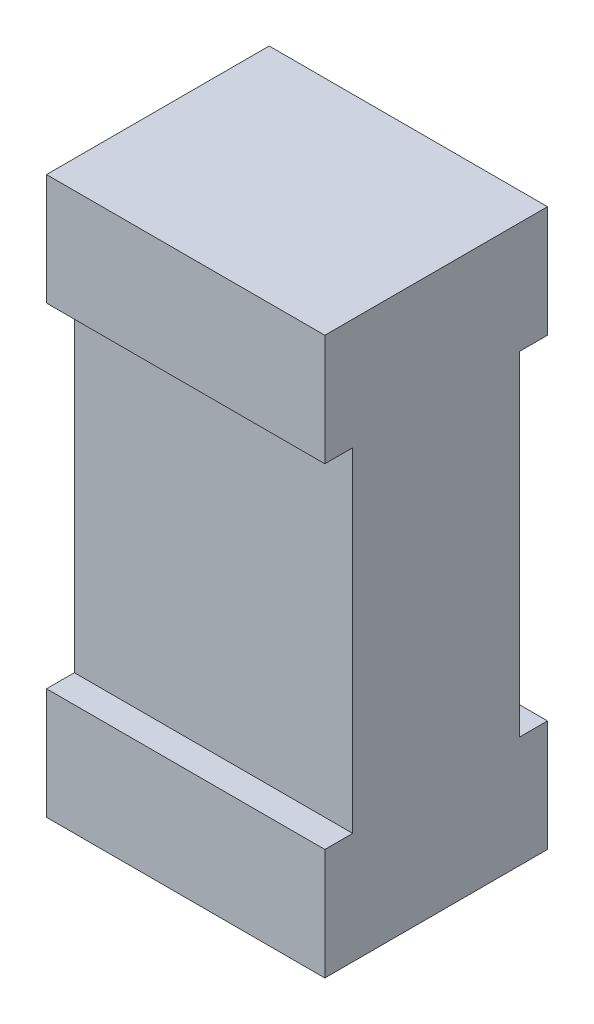
ISO-10303-21;
HEADER;
FILE_DESCRIPTION(('STEP AP214'),'2;1');
FILE_NAME('part.step','',(''),(''),'','','');
FILE_SCHEMA(('AUTOMOTIVE_DESIGN { 1 0 10303 214 1 1 1 1 }'));
ENDSEC;
DATA;
#1=APPLICATION_CONTEXT('core data for automotive mechanical design processes');
#2=APPLICATION_PROTOCOL_DEFINITION('international standard','automotive_design',2000,#1);
#3=PRODUCT_CONTEXT('',#1,'mechanical');
#4=PRODUCT('Part','Part','',(#3));
#5=PRODUCT_RELATED_PRODUCT_CATEGORY('part','',(#4));
#6=PRODUCT_DEFINITION_FORMATION('','',#4);
#7=PRODUCT_DEFINITION_CONTEXT('part definition',#1,'design');
#8=PRODUCT_DEFINITION('design','',#6,#7);
#9=PRODUCT_DEFINITION_SHAPE('','',#8);
#10=(LENGTH_UNIT() NAMED_UNIT(*) SI_UNIT(.MILLI.,.METRE.));
#11=(NAMED_UNIT(*) PLANE_ANGLE_UNIT() SI_UNIT($,.RADIAN.));
#12=(NAMED_UNIT(*) SI_UNIT($,.STERADIAN.) SOLID_ANGLE_UNIT());
#13=UNCERTAINTY_MEASURE_WITH_UNIT(LENGTH_MEASURE(1.E-05),#10,'distance_accuracy_value','');
#14=(GEOMETRIC_REPRESENTATION_CONTEXT(3) GLOBAL_UNCERTAINTY_ASSIGNED_CONTEXT((#13)) GLOBAL_UNIT_ASSIGNED_CONTEXT((#10,
#11,#12)) REPRESENTATION_CONTEXT('',''));
#15=CARTESIAN_POINT('',(0.,0.,0.));
#16=DIRECTION('',(0.,0.,1.));
#17=DIRECTION('',(1.,0.,0.));
#18=AXIS2_PLACEMENT_3D('',#15,#16,#17);
#19=CARTESIAN_POINT('',(0.5,0.,0.4));
#20=DIRECTION('',(-1.,0.,0.));
#21=DIRECTION('',(0.,-1.,0.));
#22=AXIS2_PLACEMENT_3D('',#19,#20,#21);
#23=PLANE('',#22);
#24=DIRECTION('',(0.,0.,1.));
#25=VECTOR('',#24,1.);
#26=CARTESIAN_POINT('',(0.5,-0.8,0.));
#27=LINE('',#26,#25);
#28=CARTESIAN_POINT('',(0.5,-0.8,0.));
#29=VERTEX_POINT('',#28);
#30=CARTESIAN_POINT('',(0.5,-0.8,0.05));
#31=VERTEX_POINT('',#30);
#32=EDGE_CURVE('E124',#29,#31,#27,.T.);
#33=ORIENTED_EDGE('',*,*,#32,.T.);
#34=DIRECTION('',(0.,1.,0.));
#35=VECTOR('',#34,1.);
#36=CARTESIAN_POINT('',(0.5,-0.2,0.05));
#37=LINE('',#36,#35);
#38=CARTESIAN_POINT('',(0.5,-0.2,0.05));
#39=VERTEX_POINT('',#38);
#40=EDGE_CURVE('E126',#39,#31,#37,.F.);
#41=ORIENTED_EDGE('',*,*,#40,.F.);
#42=DIRECTION('',(0.,0.,1.));
#43=VECTOR('',#42,1.);
#44=CARTESIAN_POINT('',(0.5,-0.2,0.));
#45=LINE('',#44,#43);
#46=CARTESIAN_POINT('',(0.5,-0.2,0.));
#47=VERTEX_POINT('',#46);
#48=EDGE_CURVE('E133',#39,#47,#45,.F.);
#49=ORIENTED_EDGE('',*,*,#48,.T.);
#50=DIRECTION('',(0.,1.,0.));
#51=VECTOR('',#50,1.);
#52=CARTESIAN_POINT('',(0.5,0.,0.));
#53=LINE('',#52,#51);
#54=CARTESIAN_POINT('',(0.5,0.,0.));
#55=VERTEX_POINT('',#54);
#56=EDGE_CURVE('E138',#47,#55,#53,.T.);
#57=ORIENTED_EDGE('',*,*,#56,.T.);
#58=DIRECTION('',(0.,0.,1.));
#59=VECTOR('',#58,1.);
#60=CARTESIAN_POINT('',(0.5,0.,0.4));
#61=LINE('',#60,#59);
#62=CARTESIAN_POINT('',(0.5,0.,0.4));
#63=VERTEX_POINT('',#62);
#64=EDGE_CURVE('E141',#55,#63,#61,.T.);
#65=ORIENTED_EDGE('',*,*,#64,.T.);
#66=DIRECTION('',(0.,1.,0.));
#67=VECTOR('',#66,1.);
#68=CARTESIAN_POINT('',(0.5,0.,0.4));
#69=LINE('',#68,#67);
#70=CARTESIAN_POINT('',(0.5,-0.2,0.4));
#71=VERTEX_POINT('',#70);
#72=EDGE_CURVE('E147',#71,#63,#69,.T.);
#73=ORIENTED_EDGE('',*,*,#72,.F.);
#74=DIRECTION('',(0.,0.,1.));
#75=VECTOR('',#74,1.);
#76=CARTESIAN_POINT('',(0.5,-0.2,0.));
#77=LINE('',#76,#75);
#78=CARTESIAN_POINT('',(0.5,-0.2,0.35));
#79=VERTEX_POINT('',#78);
#80=EDGE_CURVE('E154',#71,#79,#77,.F.);
#81=ORIENTED_EDGE('',*,*,#80,.T.);
#82=DIRECTION('',(0.,1.,0.));
#83=VECTOR('',#82,1.);
#84=CARTESIAN_POINT('',(0.5,-0.2,0.35));
#85=LINE('',#84,#83);
#86=CARTESIAN_POINT('',(0.5,-0.8,0.35));
#87=VERTEX_POINT('',#86);
#88=EDGE_CURVE('E157',#87,#79,#85,.T.);
#89=ORIENTED_EDGE('',*,*,#88,.F.);
#90=DIRECTION('',(0.,0.,1.));
#91=VECTOR('',#90,1.);
#92=CARTESIAN_POINT('',(0.5,-0.8,0.));
#93=LINE('',#92,#91);
#94=CARTESIAN_POINT('',(0.5,-0.8,0.4));
#95=VERTEX_POINT('',#94);
#96=EDGE_CURVE('E164',#87,#95,#93,.T.);
#97=ORIENTED_EDGE('',*,*,#96,.T.);
#98=DIRECTION('',(0.,1.,0.));
#99=VECTOR('',#98,1.);
#100=CARTESIAN_POINT('',(0.5,0.,0.4));
#101=LINE('',#100,#99);
#102=CARTESIAN_POINT('',(0.5,-1.,0.4));
#103=VERTEX_POINT('',#102);
#104=EDGE_CURVE('E106',#103,#95,#101,.T.);
#105=ORIENTED_EDGE('',*,*,#104,.F.);
#106=DIRECTION('',(0.,0.,1.));
#107=VECTOR('',#106,1.);
#108=CARTESIAN_POINT('',(0.5,-1.,0.4));
#109=LINE('',#108,#107);
#110=CARTESIAN_POINT('',(0.5,-1.,0.));
#111=VERTEX_POINT('',#110);
#112=EDGE_CURVE('E19',#103,#111,#109,.F.);
#113=ORIENTED_EDGE('',*,*,#112,.T.);
#114=DIRECTION('',(0.,1.,0.));
#115=VECTOR('',#114,1.);
#116=CARTESIAN_POINT('',(0.5,0.,0.));
#117=LINE('',#116,#115);
#118=EDGE_CURVE('E103',#111,#29,#117,.T.);
#119=ORIENTED_EDGE('',*,*,#118,.T.);
#120=EDGE_LOOP('',(#33,#41,#49,#57,#65,#73,#81,#89,#97,#105,#113,#119));
#121=FACE_BOUND('',#120,.T.);
#122=ADVANCED_FACE('F16',(#121),#23,.F.);
#123=CARTESIAN_POINT('',(0.5,-1.,0.4));
#124=DIRECTION('',(0.,1.,0.));
#125=DIRECTION('',(-1.,0.,0.));
#126=AXIS2_PLACEMENT_3D('',#123,#124,#125);
#127=PLANE('',#126);
#128=ORIENTED_EDGE('',*,*,#112,.F.);
#129=DIRECTION('',(1.,0.,0.));
#130=VECTOR('',#129,1.);
#131=CARTESIAN_POINT('',(0.,-1.,0.4));
#132=LINE('',#131,#130);
#133=CARTESIAN_POINT('',(0.,-1.,0.4));
#134=VERTEX_POINT('',#133);
#135=EDGE_CURVE('E167',#134,#103,#132,.T.);
#136=ORIENTED_EDGE('',*,*,#135,.F.);
#137=DIRECTION('',(0.,0.,-1.));
#138=VECTOR('',#137,1.);
#139=CARTESIAN_POINT('',(0.,-1.,0.4));
#140=LINE('',#139,#138);
#141=CARTESIAN_POINT('',(0.,-1.,0.));
#142=VERTEX_POINT('',#141);
#143=EDGE_CURVE('E121',#134,#142,#140,.T.);
#144=ORIENTED_EDGE('',*,*,#143,.T.);
#145=DIRECTION('',(1.,0.,0.));
#146=VECTOR('',#145,1.);
#147=CARTESIAN_POINT('',(0.,-1.,0.));
#148=LINE('',#147,#146);
#149=EDGE_CURVE('E111',#142,#111,#148,.T.);
#150=ORIENTED_EDGE('',*,*,#149,.T.);
#151=EDGE_LOOP('',(#128,#136,#144,#150));
#152=FACE_BOUND('',#151,.T.);
#153=ADVANCED_FACE('F120',(#152),#127,.F.);
#154=CARTESIAN_POINT('',(0.,0.,0.));
#155=DIRECTION('',(0.,0.,1.));
#156=DIRECTION('',(1.,0.,0.));
#157=AXIS2_PLACEMENT_3D('',#154,#155,#156);
#158=PLANE('',#157);
#159=DIRECTION('',(1.,0.,0.));
#160=VECTOR('',#159,1.);
#161=CARTESIAN_POINT('',(0.5,-0.8,0.));
#162=LINE('',#161,#160);
#163=CARTESIAN_POINT('',(0.,-0.8,0.));
#164=VERTEX_POINT('',#163);
#165=EDGE_CURVE('E117',#164,#29,#162,.T.);
#166=ORIENTED_EDGE('',*,*,#165,.T.);
#167=ORIENTED_EDGE('',*,*,#118,.F.);
#168=ORIENTED_EDGE('',*,*,#149,.F.);
#169=DIRECTION('',(0.,1.,0.));
#170=VECTOR('',#169,1.);
#171=CARTESIAN_POINT('',(0.,0.,0.));
#172=LINE('',#171,#170);
#173=EDGE_CURVE('E171',#142,#164,#172,.T.);
#174=ORIENTED_EDGE('',*,*,#173,.T.);
#175=EDGE_LOOP('',(#166,#167,#168,#174));
#176=FACE_BOUND('',#175,.T.);
#177=ADVANCED_FACE('F114',(#176),#158,.F.);
#178=CARTESIAN_POINT('',(0.5,-0.8,0.));
#179=DIRECTION('',(0.,-1.,0.));
#180=DIRECTION('',(1.,0.,0.));
#181=AXIS2_PLACEMENT_3D('',#178,#179,#180);
#182=PLANE('',#181);
#183=ORIENTED_EDGE('',*,*,#32,.F.);
#184=ORIENTED_EDGE('',*,*,#165,.F.);
#185=DIRECTION('',(0.,0.,-1.));
#186=VECTOR('',#185,1.);
#187=CARTESIAN_POINT('',(0.,-0.8,0.4));
#188=LINE('',#187,#186);
#189=CARTESIAN_POINT('',(0.,-0.8,0.05));
#190=VERTEX_POINT('',#189);
#191=EDGE_CURVE('E173',#164,#190,#188,.F.);
#192=ORIENTED_EDGE('',*,*,#191,.T.);
#193=DIRECTION('',(-1.,0.,0.));
#194=VECTOR('',#193,1.);
#195=CARTESIAN_POINT('',(1.17082039324994,-0.8,0.05));
#196=LINE('',#195,#194);
#197=EDGE_CURVE('E128',#31,#190,#196,.T.);
#198=ORIENTED_EDGE('',*,*,#197,.F.);
#199=EDGE_LOOP('',(#183,#184,#192,#198));
#200=FACE_BOUND('',#199,.T.);
#201=ADVANCED_FACE('F233',(#200),#182,.F.);
#202=CARTESIAN_POINT('',(1.17082039324994,-0.2,0.05));
#203=DIRECTION('',(0.,0.,-1.));
#204=DIRECTION('',(-1.,0.,0.));
#205=AXIS2_PLACEMENT_3D('',#202,#203,#204);
#206=PLANE('',#205);
#207=DIRECTION('',(0.,1.,0.));
#208=VECTOR('',#207,1.);
#209=CARTESIAN_POINT('',(0.,0.,0.05));
#210=LINE('',#209,#208);
#211=CARTESIAN_POINT('',(0.,-0.2,0.05));
#212=VERTEX_POINT('',#211);
#213=EDGE_CURVE('E176',#190,#212,#210,.T.);
#214=ORIENTED_EDGE('',*,*,#213,.T.);
#215=DIRECTION('',(-1.,0.,0.));
#216=VECTOR('',#215,1.);
#217=CARTESIAN_POINT('',(0.5,-0.2,0.05));
#218=LINE('',#217,#216);
#219=EDGE_CURVE('E130',#212,#39,#218,.F.);
#220=ORIENTED_EDGE('',*,*,#219,.T.);
#221=ORIENTED_EDGE('',*,*,#40,.T.);
#222=ORIENTED_EDGE('',*,*,#197,.T.);
#223=EDGE_LOOP('',(#214,#220,#221,#222));
#224=FACE_BOUND('',#223,.T.);
#225=ADVANCED_FACE('F230',(#224),#206,.T.);
#226=CARTESIAN_POINT('',(0.5,-0.2,0.));
#227=DIRECTION('',(0.,1.,0.));
#228=DIRECTION('',(-1.,0.,0.));
#229=AXIS2_PLACEMENT_3D('',#226,#227,#228);
#230=PLANE('',#229);
#231=ORIENTED_EDGE('',*,*,#219,.F.);
#232=DIRECTION('',(0.,0.,-1.));
#233=VECTOR('',#232,1.);
#234=CARTESIAN_POINT('',(0.,-0.2,0.4));
#235=LINE('',#234,#233);
#236=CARTESIAN_POINT('',(0.,-0.2,0.));
#237=VERTEX_POINT('',#236);
#238=EDGE_CURVE('E179',#212,#237,#235,.T.);
#239=ORIENTED_EDGE('',*,*,#238,.T.);
#240=DIRECTION('',(1.,0.,0.));
#241=VECTOR('',#240,1.);
#242=CARTESIAN_POINT('',(0.,-0.2,0.));
#243=LINE('',#242,#241);
#244=EDGE_CURVE('E135',#237,#47,#243,.T.);
#245=ORIENTED_EDGE('',*,*,#244,.T.);
#246=ORIENTED_EDGE('',*,*,#48,.F.);
#247=EDGE_LOOP('',(#231,#239,#245,#246));
#248=FACE_BOUND('',#247,.T.);
#249=ADVANCED_FACE('F226',(#248),#230,.F.);
#250=CARTESIAN_POINT('',(0.,0.,0.));
#251=DIRECTION('',(0.,0.,1.));
#252=DIRECTION('',(1.,0.,0.));
#253=AXIS2_PLACEMENT_3D('',#250,#251,#252);
#254=PLANE('',#253);
#255=ORIENTED_EDGE('',*,*,#244,.F.);
#256=DIRECTION('',(0.,1.,0.));
#257=VECTOR('',#256,1.);
#258=CARTESIAN_POINT('',(0.,0.,0.));
#259=LINE('',#258,#257);
#260=CARTESIAN_POINT('',(0.,0.,0.));
#261=VERTEX_POINT('',#260);
#262=EDGE_CURVE('E182',#237,#261,#259,.T.);
#263=ORIENTED_EDGE('',*,*,#262,.T.);
#264=DIRECTION('',(1.,0.,0.));
#265=VECTOR('',#264,1.);
#266=CARTESIAN_POINT('',(0.5,0.,0.));
#267=LINE('',#266,#265);
#268=EDGE_CURVE('E144',#261,#55,#267,.T.);
#269=ORIENTED_EDGE('',*,*,#268,.T.);
#270=ORIENTED_EDGE('',*,*,#56,.F.);
#271=EDGE_LOOP('',(#255,#263,#269,#270));
#272=FACE_BOUND('',#271,.T.);
#273=ADVANCED_FACE('F222',(#272),#254,.F.);
#274=CARTESIAN_POINT('',(0.5,0.,0.4));
#275=DIRECTION('',(0.,-1.,0.));
#276=DIRECTION('',(1.,0.,0.));
#277=AXIS2_PLACEMENT_3D('',#274,#275,#276);
#278=PLANE('',#277);
#279=DIRECTION('',(0.,0.,-1.));
#280=VECTOR('',#279,1.);
#281=CARTESIAN_POINT('',(0.,0.,0.4));
#282=LINE('',#281,#280);
#283=CARTESIAN_POINT('',(0.,0.,0.4));
#284=VERTEX_POINT('',#283);
#285=EDGE_CURVE('E185',#261,#284,#282,.F.);
#286=ORIENTED_EDGE('',*,*,#285,.T.);
#287=DIRECTION('',(1.,0.,0.));
#288=VECTOR('',#287,1.);
#289=CARTESIAN_POINT('',(0.,0.,0.4));
#290=LINE('',#289,#288);
#291=EDGE_CURVE('E149',#63,#284,#290,.F.);
#292=ORIENTED_EDGE('',*,*,#291,.F.);
#293=ORIENTED_EDGE('',*,*,#64,.F.);
#294=ORIENTED_EDGE('',*,*,#268,.F.);
#295=EDGE_LOOP('',(#286,#292,#293,#294));
#296=FACE_BOUND('',#295,.T.);
#297=ADVANCED_FACE('F218',(#296),#278,.F.);
#298=CARTESIAN_POINT('',(0.,0.,0.4));
#299=DIRECTION('',(0.,0.,1.));
#300=DIRECTION('',(1.,0.,0.));
#301=AXIS2_PLACEMENT_3D('',#298,#299,#300);
#302=PLANE('',#301);
#303=ORIENTED_EDGE('',*,*,#291,.T.);
#304=DIRECTION('',(0.,1.,0.));
#305=VECTOR('',#304,1.);
#306=CARTESIAN_POINT('',(0.,0.,0.4));
#307=LINE('',#306,#305);
#308=CARTESIAN_POINT('',(0.,-0.2,0.4));
#309=VERTEX_POINT('',#308);
#310=EDGE_CURVE('E188',#284,#309,#307,.F.);
#311=ORIENTED_EDGE('',*,*,#310,.T.);
#312=DIRECTION('',(-1.,0.,0.));
#313=VECTOR('',#312,1.);
#314=CARTESIAN_POINT('',(0.5,-0.2,0.4));
#315=LINE('',#314,#313);
#316=EDGE_CURVE('E151',#309,#71,#315,.F.);
#317=ORIENTED_EDGE('',*,*,#316,.T.);
#318=ORIENTED_EDGE('',*,*,#72,.T.);
#319=EDGE_LOOP('',(#303,#311,#317,#318));
#320=FACE_BOUND('',#319,.T.);
#321=ADVANCED_FACE('F215',(#320),#302,.T.);
#322=CARTESIAN_POINT('',(0.5,-0.2,0.));
#323=DIRECTION('',(0.,1.,0.));
#324=DIRECTION('',(-1.,0.,0.));
#325=AXIS2_PLACEMENT_3D('',#322,#323,#324);
#326=PLANE('',#325);
#327=ORIENTED_EDGE('',*,*,#80,.F.);
#328=ORIENTED_EDGE('',*,*,#316,.F.);
#329=DIRECTION('',(0.,0.,-1.));
#330=VECTOR('',#329,1.);
#331=CARTESIAN_POINT('',(0.,-0.2,0.4));
#332=LINE('',#331,#330);
#333=CARTESIAN_POINT('',(0.,-0.2,0.35));
#334=VERTEX_POINT('',#333);
#335=EDGE_CURVE('E191',#309,#334,#332,.T.);
#336=ORIENTED_EDGE('',*,*,#335,.T.);
#337=DIRECTION('',(1.,0.,0.));
#338=VECTOR('',#337,1.);
#339=CARTESIAN_POINT('',(1.17082039324994,-0.2,0.35));
#340=LINE('',#339,#338);
#341=EDGE_CURVE('E159',#79,#334,#340,.F.);
#342=ORIENTED_EDGE('',*,*,#341,.F.);
#343=EDGE_LOOP('',(#327,#328,#336,#342));
#344=FACE_BOUND('',#343,.T.);
#345=ADVANCED_FACE('F211',(#344),#326,.F.);
#346=CARTESIAN_POINT('',(1.17082039324994,-0.2,0.35));
#347=DIRECTION('',(0.,0.,1.));
#348=DIRECTION('',(1.,0.,0.));
#349=AXIS2_PLACEMENT_3D('',#346,#347,#348);
#350=PLANE('',#349);
#351=DIRECTION('',(0.,1.,0.));
#352=VECTOR('',#351,1.);
#353=CARTESIAN_POINT('',(0.,0.,0.35));
#354=LINE('',#353,#352);
#355=CARTESIAN_POINT('',(0.,-0.8,0.35));
#356=VERTEX_POINT('',#355);
#357=EDGE_CURVE('E194',#334,#356,#354,.F.);
#358=ORIENTED_EDGE('',*,*,#357,.T.);
#359=DIRECTION('',(1.,0.,0.));
#360=VECTOR('',#359,1.);
#361=CARTESIAN_POINT('',(0.5,-0.8,0.35));
#362=LINE('',#361,#360);
#363=EDGE_CURVE('E161',#356,#87,#362,.T.);
#364=ORIENTED_EDGE('',*,*,#363,.T.);
#365=ORIENTED_EDGE('',*,*,#88,.T.);
#366=ORIENTED_EDGE('',*,*,#341,.T.);
#367=EDGE_LOOP('',(#358,#364,#365,#366));
#368=FACE_BOUND('',#367,.T.);
#369=ADVANCED_FACE('F207',(#368),#350,.T.);
#370=CARTESIAN_POINT('',(0.5,-0.8,0.));
#371=DIRECTION('',(0.,-1.,0.));
#372=DIRECTION('',(1.,0.,0.));
#373=AXIS2_PLACEMENT_3D('',#370,#371,#372);
#374=PLANE('',#373);
#375=ORIENTED_EDGE('',*,*,#363,.F.);
#376=DIRECTION('',(0.,0.,-1.));
#377=VECTOR('',#376,1.);
#378=CARTESIAN_POINT('',(0.,-0.8,0.4));
#379=LINE('',#378,#377);
#380=CARTESIAN_POINT('',(0.,-0.8,0.4));
#381=VERTEX_POINT('',#380);
#382=EDGE_CURVE('E25',#356,#381,#379,.F.);
#383=ORIENTED_EDGE('',*,*,#382,.T.);
#384=DIRECTION('',(1.,0.,0.));
#385=VECTOR('',#384,1.);
#386=CARTESIAN_POINT('',(0.,-0.8,0.4));
#387=LINE('',#386,#385);
#388=EDGE_CURVE('E33',#95,#381,#387,.F.);
#389=ORIENTED_EDGE('',*,*,#388,.F.);
#390=ORIENTED_EDGE('',*,*,#96,.F.);
#391=EDGE_LOOP('',(#375,#383,#389,#390));
#392=FACE_BOUND('',#391,.T.);
#393=ADVANCED_FACE('F200',(#392),#374,.F.);
#394=CARTESIAN_POINT('',(0.,0.,0.4));
#395=DIRECTION('',(0.,0.,1.));
#396=DIRECTION('',(1.,0.,0.));
#397=AXIS2_PLACEMENT_3D('',#394,#395,#396);
#398=PLANE('',#397);
#399=ORIENTED_EDGE('',*,*,#135,.T.);
#400=ORIENTED_EDGE('',*,*,#104,.T.);
#401=ORIENTED_EDGE('',*,*,#388,.T.);
#402=DIRECTION('',(0.,1.,0.));
#403=VECTOR('',#402,1.);
#404=CARTESIAN_POINT('',(0.,0.,0.4));
#405=LINE('',#404,#403);
#406=EDGE_CURVE('E11',#381,#134,#405,.F.);
#407=ORIENTED_EDGE('',*,*,#406,.T.);
#408=EDGE_LOOP('',(#399,#400,#401,#407));
#409=FACE_BOUND('',#408,.T.);
#410=ADVANCED_FACE('F234',(#409),#398,.T.);
#411=CARTESIAN_POINT('',(0.,0.,0.4));
#412=DIRECTION('',(1.,0.,0.));
#413=DIRECTION('',(0.,0.,-1.));
#414=AXIS2_PLACEMENT_3D('',#411,#412,#413);
#415=PLANE('',#414);
#416=ORIENTED_EDGE('',*,*,#382,.F.);
#417=ORIENTED_EDGE('',*,*,#357,.F.);
#418=ORIENTED_EDGE('',*,*,#335,.F.);
#419=ORIENTED_EDGE('',*,*,#310,.F.);
#420=ORIENTED_EDGE('',*,*,#285,.F.);
#421=ORIENTED_EDGE('',*,*,#262,.F.);
#422=ORIENTED_EDGE('',*,*,#238,.F.);
#423=ORIENTED_EDGE('',*,*,#213,.F.);
#424=ORIENTED_EDGE('',*,*,#191,.F.);
#425=ORIENTED_EDGE('',*,*,#173,.F.);
#426=ORIENTED_EDGE('',*,*,#143,.F.);
#427=ORIENTED_EDGE('',*,*,#406,.F.);
#428=EDGE_LOOP('',(#416,#417,#418,#419,#420,#421,#422,#423,#424,#425,#426,#427));
#429=FACE_BOUND('',#428,.T.);
#430=ADVANCED_FACE('F204',(#429),#415,.F.);
#431=CLOSED_SHELL('',(#122,#153,#177,#201,#225,#249,#273,#297,#321,#345,#369,#393,#410,#430));
#432=MANIFOLD_SOLID_BREP('B1',#431);
#433=ADVANCED_BREP_SHAPE_REPRESENTATION('',(#18,#432),#14);
#434=SHAPE_DEFINITION_REPRESENTATION(#9,#433);
ENDSEC;
END-ISO-10303-21;
